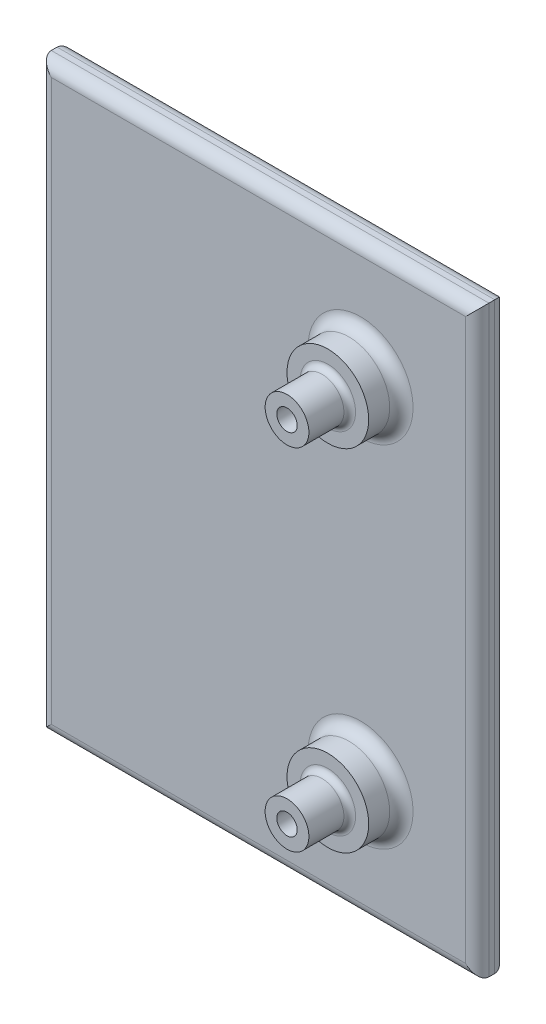
ISO-10303-21;
HEADER;
FILE_DESCRIPTION(('STEP AP214'),'2;1');
FILE_NAME('part.step','',(''),(''),'','','');
FILE_SCHEMA(('AUTOMOTIVE_DESIGN { 1 0 10303 214 1 1 1 1 }'));
ENDSEC;
DATA;
#1=APPLICATION_CONTEXT('core data for automotive mechanical design processes');
#2=APPLICATION_PROTOCOL_DEFINITION('international standard','automotive_design',2000,#1);
#3=PRODUCT_CONTEXT('',#1,'mechanical');
#4=PRODUCT('Part','Part','',(#3));
#5=PRODUCT_RELATED_PRODUCT_CATEGORY('part','',(#4));
#6=PRODUCT_DEFINITION_FORMATION('','',#4);
#7=PRODUCT_DEFINITION_CONTEXT('part definition',#1,'design');
#8=PRODUCT_DEFINITION('design','',#6,#7);
#9=PRODUCT_DEFINITION_SHAPE('','',#8);
#10=(LENGTH_UNIT() NAMED_UNIT(*) SI_UNIT(.MILLI.,.METRE.));
#11=(NAMED_UNIT(*) PLANE_ANGLE_UNIT() SI_UNIT($,.RADIAN.));
#12=(NAMED_UNIT(*) SI_UNIT($,.STERADIAN.) SOLID_ANGLE_UNIT());
#13=UNCERTAINTY_MEASURE_WITH_UNIT(LENGTH_MEASURE(1.E-05),#10,'distance_accuracy_value','');
#14=(GEOMETRIC_REPRESENTATION_CONTEXT(3) GLOBAL_UNCERTAINTY_ASSIGNED_CONTEXT((#13)) GLOBAL_UNIT_ASSIGNED_CONTEXT((#10,
#11,#12)) REPRESENTATION_CONTEXT('',''));
#15=CARTESIAN_POINT('',(0.,0.,0.));
#16=DIRECTION('',(0.,0.,1.));
#17=DIRECTION('',(1.,0.,0.));
#18=AXIS2_PLACEMENT_3D('',#15,#16,#17);
#19=CARTESIAN_POINT('',(0.,0.,5.));
#20=DIRECTION('',(0.,1.,0.));
#21=DIRECTION('',(-1.,0.,0.));
#22=AXIS2_PLACEMENT_3D('',#19,#20,#21);
#23=PLANE('',#22);
#24=DIRECTION('',(0.,0.,-1.));
#25=VECTOR('',#24,1.);
#26=CARTESIAN_POINT('',(-75.,0.,5.));
#27=LINE('',#26,#25);
#28=CARTESIAN_POINT('',(-75.,0.,3.));
#29=VERTEX_POINT('',#28);
#30=CARTESIAN_POINT('',(-75.,0.,2.));
#31=VERTEX_POINT('',#30);
#32=EDGE_CURVE('E293',#29,#31,#27,.T.);
#33=ORIENTED_EDGE('',*,*,#32,.T.);
#34=DIRECTION('',(1.,0.,0.));
#35=VECTOR('',#34,1.);
#36=CARTESIAN_POINT('',(0.,0.,2.));
#37=LINE('',#36,#35);
#38=CARTESIAN_POINT('',(0.,0.,2.));
#39=VERTEX_POINT('',#38);
#40=EDGE_CURVE('E186',#31,#39,#37,.T.);
#41=ORIENTED_EDGE('',*,*,#40,.T.);
#42=DIRECTION('',(0.,0.,-1.));
#43=VECTOR('',#42,1.);
#44=CARTESIAN_POINT('',(0.,0.,5.));
#45=LINE('',#44,#43);
#46=CARTESIAN_POINT('',(0.,0.,3.));
#47=VERTEX_POINT('',#46);
#48=EDGE_CURVE('E303',#47,#39,#45,.T.);
#49=ORIENTED_EDGE('',*,*,#48,.F.);
#50=DIRECTION('',(1.,0.,0.));
#51=VECTOR('',#50,1.);
#52=CARTESIAN_POINT('',(0.,0.,3.));
#53=LINE('',#52,#51);
#54=EDGE_CURVE('E68',#47,#29,#53,.F.);
#55=ORIENTED_EDGE('',*,*,#54,.T.);
#56=EDGE_LOOP('',(#33,#41,#49,#55));
#57=FACE_BOUND('',#56,.T.);
#58=ADVANCED_FACE('F45',(#57),#23,.F.);
#59=CARTESIAN_POINT('',(0.,0.,5.));
#60=DIRECTION('',(-1.,0.,0.));
#61=DIRECTION('',(0.,0.,1.));
#62=AXIS2_PLACEMENT_3D('',#59,#60,#61);
#63=PLANE('',#62);
#64=ORIENTED_EDGE('',*,*,#48,.T.);
#65=DIRECTION('',(0.,1.,0.));
#66=VECTOR('',#65,1.);
#67=CARTESIAN_POINT('',(0.,100.,2.));
#68=LINE('',#67,#66);
#69=CARTESIAN_POINT('',(0.,100.,2.));
#70=VERTEX_POINT('',#69);
#71=EDGE_CURVE('E181',#39,#70,#68,.T.);
#72=ORIENTED_EDGE('',*,*,#71,.T.);
#73=DIRECTION('',(0.,0.,-1.));
#74=VECTOR('',#73,1.);
#75=CARTESIAN_POINT('',(0.,100.,5.));
#76=LINE('',#75,#74);
#77=CARTESIAN_POINT('',(0.,100.,3.));
#78=VERTEX_POINT('',#77);
#79=EDGE_CURVE('E299',#78,#70,#76,.T.);
#80=ORIENTED_EDGE('',*,*,#79,.F.);
#81=DIRECTION('',(0.,1.,0.));
#82=VECTOR('',#81,1.);
#83=CARTESIAN_POINT('',(0.,0.,3.));
#84=LINE('',#83,#82);
#85=EDGE_CURVE('E178',#78,#47,#84,.F.);
#86=ORIENTED_EDGE('',*,*,#85,.T.);
#87=EDGE_LOOP('',(#64,#72,#80,#86));
#88=FACE_BOUND('',#87,.T.);
#89=ADVANCED_FACE('F240',(#88),#63,.F.);
#90=CARTESIAN_POINT('',(0.,100.,5.));
#91=DIRECTION('',(0.,-1.,0.));
#92=DIRECTION('',(1.,0.,0.));
#93=AXIS2_PLACEMENT_3D('',#90,#91,#92);
#94=PLANE('',#93);
#95=ORIENTED_EDGE('',*,*,#79,.T.);
#96=DIRECTION('',(-1.,0.,0.));
#97=VECTOR('',#96,1.);
#98=CARTESIAN_POINT('',(-75.,100.,2.));
#99=LINE('',#98,#97);
#100=CARTESIAN_POINT('',(-75.,100.,2.));
#101=VERTEX_POINT('',#100);
#102=EDGE_CURVE('E161',#70,#101,#99,.T.);
#103=ORIENTED_EDGE('',*,*,#102,.T.);
#104=DIRECTION('',(0.,0.,-1.));
#105=VECTOR('',#104,1.);
#106=CARTESIAN_POINT('',(-75.,100.,5.));
#107=LINE('',#106,#105);
#108=CARTESIAN_POINT('',(-75.,100.,3.));
#109=VERTEX_POINT('',#108);
#110=EDGE_CURVE('E292',#109,#101,#107,.T.);
#111=ORIENTED_EDGE('',*,*,#110,.F.);
#112=DIRECTION('',(-1.,0.,0.));
#113=VECTOR('',#112,1.);
#114=CARTESIAN_POINT('',(0.,100.,3.));
#115=LINE('',#114,#113);
#116=EDGE_CURVE('E120',#109,#78,#115,.F.);
#117=ORIENTED_EDGE('',*,*,#116,.T.);
#118=EDGE_LOOP('',(#95,#103,#111,#117));
#119=FACE_BOUND('',#118,.T.);
#120=ADVANCED_FACE('F246',(#119),#94,.F.);
#121=CARTESIAN_POINT('',(-75.,0.,5.));
#122=DIRECTION('',(1.,0.,0.));
#123=DIRECTION('',(0.,0.,-1.));
#124=AXIS2_PLACEMENT_3D('',#121,#122,#123);
#125=PLANE('',#124);
#126=ORIENTED_EDGE('',*,*,#110,.T.);
#127=DIRECTION('',(0.,-1.,0.));
#128=VECTOR('',#127,1.);
#129=CARTESIAN_POINT('',(-75.,0.,2.));
#130=LINE('',#129,#128);
#131=EDGE_CURVE('E61',#101,#31,#130,.T.);
#132=ORIENTED_EDGE('',*,*,#131,.T.);
#133=ORIENTED_EDGE('',*,*,#32,.F.);
#134=DIRECTION('',(0.,-1.,0.));
#135=VECTOR('',#134,1.);
#136=CARTESIAN_POINT('',(-75.,0.,3.));
#137=LINE('',#136,#135);
#138=EDGE_CURVE('E189',#29,#109,#137,.F.);
#139=ORIENTED_EDGE('',*,*,#138,.T.);
#140=EDGE_LOOP('',(#126,#132,#133,#139));
#141=FACE_BOUND('',#140,.T.);
#142=ADVANCED_FACE('F291',(#141),#125,.F.);
#143=CARTESIAN_POINT('',(0.,0.,5.));
#144=DIRECTION('',(0.,0.,-1.));
#145=DIRECTION('',(-1.,0.,0.));
#146=AXIS2_PLACEMENT_3D('',#143,#144,#145);
#147=PLANE('',#146);
#148=CARTESIAN_POINT('',(-20.,20.,5.));
#149=DIRECTION('',(0.,0.,-1.));
#150=DIRECTION('',(-1.,0.,0.));
#151=AXIS2_PLACEMENT_3D('',#148,#149,#150);
#152=CIRCLE('',#151,9.);
#153=CARTESIAN_POINT('',(-29.,20.,5.));
#154=VERTEX_POINT('',#153);
#155=EDGE_CURVE('E147',#154,#154,#152,.T.);
#156=ORIENTED_EDGE('',*,*,#155,.T.);
#157=EDGE_LOOP('',(#156));
#158=FACE_BOUND('',#157,.T.);
#159=CARTESIAN_POINT('',(-20.,80.,5.));
#160=DIRECTION('',(0.,0.,-1.));
#161=DIRECTION('',(-1.,0.,0.));
#162=AXIS2_PLACEMENT_3D('',#159,#160,#161);
#163=CIRCLE('',#162,9.);
#164=CARTESIAN_POINT('',(-29.,80.,5.));
#165=VERTEX_POINT('',#164);
#166=EDGE_CURVE('E142',#165,#165,#163,.T.);
#167=ORIENTED_EDGE('',*,*,#166,.T.);
#168=EDGE_LOOP('',(#167));
#169=FACE_BOUND('',#168,.T.);
#170=DIRECTION('',(0.,1.,0.));
#171=VECTOR('',#170,1.);
#172=CARTESIAN_POINT('',(-2.,0.,5.));
#173=LINE('',#172,#171);
#174=CARTESIAN_POINT('',(-2.,2.,5.));
#175=VERTEX_POINT('',#174);
#176=CARTESIAN_POINT('',(-2.,98.,5.));
#177=VERTEX_POINT('',#176);
#178=EDGE_CURVE('E139',#175,#177,#173,.T.);
#179=ORIENTED_EDGE('',*,*,#178,.T.);
#180=DIRECTION('',(-1.,0.,0.));
#181=VECTOR('',#180,1.);
#182=CARTESIAN_POINT('',(0.,98.,5.));
#183=LINE('',#182,#181);
#184=CARTESIAN_POINT('',(-73.,98.,5.));
#185=VERTEX_POINT('',#184);
#186=EDGE_CURVE('E118',#177,#185,#183,.T.);
#187=ORIENTED_EDGE('',*,*,#186,.T.);
#188=DIRECTION('',(0.,-1.,0.));
#189=VECTOR('',#188,1.);
#190=CARTESIAN_POINT('',(-73.,0.,5.));
#191=LINE('',#190,#189);
#192=CARTESIAN_POINT('',(-73.,1.99999999999999,5.));
#193=VERTEX_POINT('',#192);
#194=EDGE_CURVE('E127',#185,#193,#191,.T.);
#195=ORIENTED_EDGE('',*,*,#194,.T.);
#196=DIRECTION('',(1.,0.,0.));
#197=VECTOR('',#196,1.);
#198=CARTESIAN_POINT('',(0.,2.,5.));
#199=LINE('',#198,#197);
#200=EDGE_CURVE('E134',#193,#175,#199,.T.);
#201=ORIENTED_EDGE('',*,*,#200,.T.);
#202=EDGE_LOOP('',(#179,#187,#195,#201));
#203=FACE_BOUND('',#202,.T.);
#204=ADVANCED_FACE('F137',(#158,#169,#203),#147,.F.);
#205=CARTESIAN_POINT('',(0.,0.,0.));
#206=DIRECTION('',(0.,0.,-1.));
#207=DIRECTION('',(-1.,0.,0.));
#208=AXIS2_PLACEMENT_3D('',#205,#206,#207);
#209=PLANE('',#208);
#210=DIRECTION('',(0.,-1.,0.));
#211=VECTOR('',#210,1.);
#212=CARTESIAN_POINT('',(-73.,100.,0.));
#213=LINE('',#212,#211);
#214=CARTESIAN_POINT('',(-73.,1.99999999999999,0.));
#215=VERTEX_POINT('',#214);
#216=CARTESIAN_POINT('',(-73.,98.,0.));
#217=VERTEX_POINT('',#216);
#218=EDGE_CURVE('E165',#215,#217,#213,.F.);
#219=ORIENTED_EDGE('',*,*,#218,.T.);
#220=DIRECTION('',(-1.,0.,0.));
#221=VECTOR('',#220,1.);
#222=CARTESIAN_POINT('',(0.,98.,0.));
#223=LINE('',#222,#221);
#224=CARTESIAN_POINT('',(-2.,98.,0.));
#225=VERTEX_POINT('',#224);
#226=EDGE_CURVE('E174',#217,#225,#223,.F.);
#227=ORIENTED_EDGE('',*,*,#226,.T.);
#228=DIRECTION('',(0.,1.,0.));
#229=VECTOR('',#228,1.);
#230=CARTESIAN_POINT('',(-2.,0.,0.));
#231=LINE('',#230,#229);
#232=CARTESIAN_POINT('',(-2.,2.,0.));
#233=VERTEX_POINT('',#232);
#234=EDGE_CURVE('E171',#225,#233,#231,.F.);
#235=ORIENTED_EDGE('',*,*,#234,.T.);
#236=DIRECTION('',(1.,0.,0.));
#237=VECTOR('',#236,1.);
#238=CARTESIAN_POINT('',(-75.,1.99999999999999,0.));
#239=LINE('',#238,#237);
#240=EDGE_CURVE('E168',#233,#215,#239,.F.);
#241=ORIENTED_EDGE('',*,*,#240,.T.);
#242=EDGE_LOOP('',(#219,#227,#235,#241));
#243=FACE_BOUND('',#242,.T.);
#244=CARTESIAN_POINT('',(-20.,80.,0.));
#245=DIRECTION('',(0.,0.,-1.));
#246=DIRECTION('',(-1.,0.,0.));
#247=AXIS2_PLACEMENT_3D('',#244,#245,#246);
#248=CIRCLE('',#247,1.75);
#249=CARTESIAN_POINT('',(-21.75,80.,0.));
#250=VERTEX_POINT('',#249);
#251=EDGE_CURVE('E335',#250,#250,#248,.T.);
#252=ORIENTED_EDGE('',*,*,#251,.F.);
#253=EDGE_LOOP('',(#252));
#254=FACE_BOUND('',#253,.T.);
#255=CARTESIAN_POINT('',(-20.,20.,0.));
#256=DIRECTION('',(0.,0.,-1.));
#257=DIRECTION('',(-1.,0.,0.));
#258=AXIS2_PLACEMENT_3D('',#255,#256,#257);
#259=CIRCLE('',#258,1.75);
#260=CARTESIAN_POINT('',(-21.75,20.,0.));
#261=VERTEX_POINT('',#260);
#262=EDGE_CURVE('E338',#261,#261,#259,.F.);
#263=ORIENTED_EDGE('',*,*,#262,.T.);
#264=EDGE_LOOP('',(#263));
#265=FACE_BOUND('',#264,.T.);
#266=ADVANCED_FACE('F325',(#243,#254,#265),#209,.T.);
#267=CARTESIAN_POINT('',(-20.,20.,10.6));
#268=DIRECTION('',(0.,0.,-1.));
#269=DIRECTION('',(-1.,0.,0.));
#270=AXIS2_PLACEMENT_3D('',#267,#268,#269);
#271=CYLINDRICAL_SURFACE('',#270,7.);
#272=CARTESIAN_POINT('',(-20.,20.,7.));
#273=DIRECTION('',(0.,0.,-1.));
#274=DIRECTION('',(-1.,0.,0.));
#275=AXIS2_PLACEMENT_3D('',#272,#273,#274);
#276=CIRCLE('',#275,7.);
#277=CARTESIAN_POINT('',(-27.,20.,7.));
#278=VERTEX_POINT('',#277);
#279=EDGE_CURVE('E135',#278,#278,#276,.F.);
#280=ORIENTED_EDGE('',*,*,#279,.T.);
#281=EDGE_LOOP('',(#280));
#282=FACE_BOUND('',#281,.T.);
#283=CARTESIAN_POINT('',(-20.,20.,10.6));
#284=DIRECTION('',(0.,0.,1.));
#285=DIRECTION('',(1.,0.,0.));
#286=AXIS2_PLACEMENT_3D('',#283,#284,#285);
#287=CIRCLE('',#286,7.);
#288=CARTESIAN_POINT('',(-13.,20.,10.6));
#289=VERTEX_POINT('',#288);
#290=EDGE_CURVE('E305',#289,#289,#287,.T.);
#291=ORIENTED_EDGE('',*,*,#290,.F.);
#292=EDGE_LOOP('',(#291));
#293=FACE_BOUND('',#292,.T.);
#294=ADVANCED_FACE('F330',(#282,#293),#271,.T.);
#295=CARTESIAN_POINT('',(-20.,20.,10.6));
#296=DIRECTION('',(0.,0.,1.));
#297=DIRECTION('',(1.,0.,0.));
#298=AXIS2_PLACEMENT_3D('',#295,#296,#297);
#299=PLANE('',#298);
#300=CARTESIAN_POINT('',(-20.,20.,10.6));
#301=DIRECTION('',(0.,0.,1.));
#302=DIRECTION('',(1.,0.,0.));
#303=AXIS2_PLACEMENT_3D('',#300,#301,#302);
#304=CIRCLE('',#303,4.75);
#305=CARTESIAN_POINT('',(-15.25,20.,10.6));
#306=VERTEX_POINT('',#305);
#307=EDGE_CURVE('E11',#306,#306,#304,.F.);
#308=ORIENTED_EDGE('',*,*,#307,.T.);
#309=EDGE_LOOP('',(#308));
#310=FACE_BOUND('',#309,.T.);
#311=ORIENTED_EDGE('',*,*,#290,.T.);
#312=EDGE_LOOP('',(#311));
#313=FACE_BOUND('',#312,.T.);
#314=ADVANCED_FACE('F356',(#310,#313),#299,.T.);
#315=CARTESIAN_POINT('',(-20.,20.,17.6));
#316=DIRECTION('',(0.,0.,-1.));
#317=DIRECTION('',(-1.,0.,0.));
#318=AXIS2_PLACEMENT_3D('',#315,#316,#317);
#319=CYLINDRICAL_SURFACE('',#318,3.75);
#320=CARTESIAN_POINT('',(-20.,20.,11.6));
#321=DIRECTION('',(0.,0.,1.));
#322=DIRECTION('',(1.,0.,0.));
#323=AXIS2_PLACEMENT_3D('',#320,#321,#322);
#324=CIRCLE('',#323,3.75);
#325=CARTESIAN_POINT('',(-16.25,20.,11.6));
#326=VERTEX_POINT('',#325);
#327=EDGE_CURVE('E54',#326,#326,#324,.T.);
#328=ORIENTED_EDGE('',*,*,#327,.T.);
#329=EDGE_LOOP('',(#328));
#330=FACE_BOUND('',#329,.T.);
#331=CARTESIAN_POINT('',(-20.,20.,17.6));
#332=DIRECTION('',(0.,0.,1.));
#333=DIRECTION('',(1.,0.,0.));
#334=AXIS2_PLACEMENT_3D('',#331,#332,#333);
#335=CIRCLE('',#334,3.75);
#336=CARTESIAN_POINT('',(-16.25,20.,17.6));
#337=VERTEX_POINT('',#336);
#338=EDGE_CURVE('E341',#337,#337,#335,.T.);
#339=ORIENTED_EDGE('',*,*,#338,.F.);
#340=EDGE_LOOP('',(#339));
#341=FACE_BOUND('',#340,.T.);
#342=ADVANCED_FACE('F228',(#330,#341),#319,.T.);
#343=CARTESIAN_POINT('',(-20.,20.,17.6));
#344=DIRECTION('',(0.,0.,1.));
#345=DIRECTION('',(1.,0.,0.));
#346=AXIS2_PLACEMENT_3D('',#343,#344,#345);
#347=PLANE('',#346);
#348=CARTESIAN_POINT('',(-20.,20.,17.6));
#349=DIRECTION('',(0.,0.,1.));
#350=DIRECTION('',(1.,0.,0.));
#351=AXIS2_PLACEMENT_3D('',#348,#349,#350);
#352=CIRCLE('',#351,1.75);
#353=CARTESIAN_POINT('',(-18.25,20.,17.6));
#354=VERTEX_POINT('',#353);
#355=EDGE_CURVE('E342',#354,#354,#352,.T.);
#356=ORIENTED_EDGE('',*,*,#355,.F.);
#357=EDGE_LOOP('',(#356));
#358=FACE_BOUND('',#357,.T.);
#359=ORIENTED_EDGE('',*,*,#338,.T.);
#360=EDGE_LOOP('',(#359));
#361=FACE_BOUND('',#360,.T.);
#362=ADVANCED_FACE('F413',(#358,#361),#347,.T.);
#363=CARTESIAN_POINT('',(-20.,20.,-4.94974746830584));
#364=DIRECTION('',(0.,0.,1.));
#365=DIRECTION('',(1.,0.,0.));
#366=AXIS2_PLACEMENT_3D('',#363,#364,#365);
#367=CYLINDRICAL_SURFACE('',#366,1.75);
#368=ORIENTED_EDGE('',*,*,#355,.T.);
#369=EDGE_LOOP('',(#368));
#370=FACE_BOUND('',#369,.T.);
#371=ORIENTED_EDGE('',*,*,#262,.F.);
#372=EDGE_LOOP('',(#371));
#373=FACE_BOUND('',#372,.T.);
#374=ADVANCED_FACE('F422',(#370,#373),#367,.F.);
#375=CARTESIAN_POINT('',(-20.,80.,10.6));
#376=DIRECTION('',(0.,0.,-1.));
#377=DIRECTION('',(-1.,0.,0.));
#378=AXIS2_PLACEMENT_3D('',#375,#376,#377);
#379=CYLINDRICAL_SURFACE('',#378,7.);
#380=CARTESIAN_POINT('',(-20.,80.,7.));
#381=DIRECTION('',(0.,0.,-1.));
#382=DIRECTION('',(-1.,0.,0.));
#383=AXIS2_PLACEMENT_3D('',#380,#381,#382);
#384=CIRCLE('',#383,7.);
#385=CARTESIAN_POINT('',(-27.,80.,7.));
#386=VERTEX_POINT('',#385);
#387=EDGE_CURVE('E155',#386,#386,#384,.F.);
#388=ORIENTED_EDGE('',*,*,#387,.T.);
#389=EDGE_LOOP('',(#388));
#390=FACE_BOUND('',#389,.T.);
#391=CARTESIAN_POINT('',(-20.,80.,10.6));
#392=DIRECTION('',(0.,0.,-1.));
#393=DIRECTION('',(1.,0.,0.));
#394=AXIS2_PLACEMENT_3D('',#391,#392,#393);
#395=CIRCLE('',#394,7.);
#396=CARTESIAN_POINT('',(-13.,80.,10.6));
#397=VERTEX_POINT('',#396);
#398=EDGE_CURVE('E349',#397,#397,#395,.T.);
#399=ORIENTED_EDGE('',*,*,#398,.T.);
#400=EDGE_LOOP('',(#399));
#401=FACE_BOUND('',#400,.T.);
#402=ADVANCED_FACE('F432',(#390,#401),#379,.T.);
#403=CARTESIAN_POINT('',(-20.,80.,10.6));
#404=DIRECTION('',(0.,0.,1.));
#405=DIRECTION('',(1.,0.,0.));
#406=AXIS2_PLACEMENT_3D('',#403,#404,#405);
#407=PLANE('',#406);
#408=CARTESIAN_POINT('',(-20.,80.,10.6));
#409=DIRECTION('',(0.,0.,1.));
#410=DIRECTION('',(1.,0.,0.));
#411=AXIS2_PLACEMENT_3D('',#408,#409,#410);
#412=CIRCLE('',#411,4.75);
#413=CARTESIAN_POINT('',(-15.25,80.,10.6));
#414=VERTEX_POINT('',#413);
#415=EDGE_CURVE('E194',#414,#414,#412,.F.);
#416=ORIENTED_EDGE('',*,*,#415,.T.);
#417=EDGE_LOOP('',(#416));
#418=FACE_BOUND('',#417,.T.);
#419=ORIENTED_EDGE('',*,*,#398,.F.);
#420=EDGE_LOOP('',(#419));
#421=FACE_BOUND('',#420,.T.);
#422=ADVANCED_FACE('F442',(#418,#421),#407,.T.);
#423=CARTESIAN_POINT('',(-20.,80.,17.6));
#424=DIRECTION('',(0.,0.,-1.));
#425=DIRECTION('',(-1.,0.,0.));
#426=AXIS2_PLACEMENT_3D('',#423,#424,#425);
#427=CYLINDRICAL_SURFACE('',#426,3.75);
#428=CARTESIAN_POINT('',(-20.,80.,11.6));
#429=DIRECTION('',(0.,0.,1.));
#430=DIRECTION('',(1.,0.,0.));
#431=AXIS2_PLACEMENT_3D('',#428,#429,#430);
#432=CIRCLE('',#431,3.75);
#433=CARTESIAN_POINT('',(-16.25,80.,11.6));
#434=VERTEX_POINT('',#433);
#435=EDGE_CURVE('E221',#434,#434,#432,.T.);
#436=ORIENTED_EDGE('',*,*,#435,.T.);
#437=EDGE_LOOP('',(#436));
#438=FACE_BOUND('',#437,.T.);
#439=CARTESIAN_POINT('',(-20.,80.,17.6));
#440=DIRECTION('',(0.,0.,-1.));
#441=DIRECTION('',(1.,0.,0.));
#442=AXIS2_PLACEMENT_3D('',#439,#440,#441);
#443=CIRCLE('',#442,3.75);
#444=CARTESIAN_POINT('',(-16.25,80.,17.6));
#445=VERTEX_POINT('',#444);
#446=EDGE_CURVE('E553',#445,#445,#443,.T.);
#447=ORIENTED_EDGE('',*,*,#446,.T.);
#448=EDGE_LOOP('',(#447));
#449=FACE_BOUND('',#448,.T.);
#450=ADVANCED_FACE('F451',(#438,#449),#427,.T.);
#451=CARTESIAN_POINT('',(-20.,80.,17.6));
#452=DIRECTION('',(0.,0.,1.));
#453=DIRECTION('',(1.,0.,0.));
#454=AXIS2_PLACEMENT_3D('',#451,#452,#453);
#455=PLANE('',#454);
#456=CARTESIAN_POINT('',(-20.,80.,17.6));
#457=DIRECTION('',(0.,0.,-1.));
#458=DIRECTION('',(1.,0.,0.));
#459=AXIS2_PLACEMENT_3D('',#456,#457,#458);
#460=CIRCLE('',#459,1.75);
#461=CARTESIAN_POINT('',(-18.25,80.,17.6));
#462=VERTEX_POINT('',#461);
#463=EDGE_CURVE('E209',#462,#462,#460,.T.);
#464=ORIENTED_EDGE('',*,*,#463,.T.);
#465=EDGE_LOOP('',(#464));
#466=FACE_BOUND('',#465,.T.);
#467=ORIENTED_EDGE('',*,*,#446,.F.);
#468=EDGE_LOOP('',(#467));
#469=FACE_BOUND('',#468,.T.);
#470=ADVANCED_FACE('F461',(#466,#469),#455,.T.);
#471=CARTESIAN_POINT('',(-20.,80.,-4.94974746830584));
#472=DIRECTION('',(0.,0.,1.));
#473=DIRECTION('',(1.,0.,0.));
#474=AXIS2_PLACEMENT_3D('',#471,#472,#473);
#475=CYLINDRICAL_SURFACE('',#474,1.75);
#476=ORIENTED_EDGE('',*,*,#463,.F.);
#477=EDGE_LOOP('',(#476));
#478=FACE_BOUND('',#477,.T.);
#479=ORIENTED_EDGE('',*,*,#251,.T.);
#480=EDGE_LOOP('',(#479));
#481=FACE_BOUND('',#480,.T.);
#482=ADVANCED_FACE('F255',(#478,#481),#475,.F.);
#483=CARTESIAN_POINT('',(-20.,20.,7.));
#484=DIRECTION('',(0.,0.,-1.));
#485=DIRECTION('',(-1.,0.,0.));
#486=AXIS2_PLACEMENT_3D('',#483,#484,#485);
#487=TOROIDAL_SURFACE('',#486,9.,2.);
#488=ORIENTED_EDGE('',*,*,#155,.F.);
#489=EDGE_LOOP('',(#488));
#490=FACE_BOUND('',#489,.T.);
#491=ORIENTED_EDGE('',*,*,#279,.F.);
#492=EDGE_LOOP('',(#491));
#493=FACE_BOUND('',#492,.T.);
#494=ADVANCED_FACE('F251',(#490,#493),#487,.F.);
#495=CARTESIAN_POINT('',(-20.,80.,7.));
#496=DIRECTION('',(0.,0.,-1.));
#497=DIRECTION('',(-1.,0.,0.));
#498=AXIS2_PLACEMENT_3D('',#495,#496,#497);
#499=TOROIDAL_SURFACE('',#498,9.,2.);
#500=ORIENTED_EDGE('',*,*,#387,.F.);
#501=EDGE_LOOP('',(#500));
#502=FACE_BOUND('',#501,.T.);
#503=ORIENTED_EDGE('',*,*,#166,.F.);
#504=EDGE_LOOP('',(#503));
#505=FACE_BOUND('',#504,.T.);
#506=ADVANCED_FACE('F254',(#502,#505),#499,.F.);
#507=CARTESIAN_POINT('',(0.,2.,2.));
#508=DIRECTION('',(-1.,0.,0.));
#509=DIRECTION('',(0.,-1.,0.));
#510=AXIS2_PLACEMENT_3D('',#507,#508,#509);
#511=CYLINDRICAL_SURFACE('',#510,2.);
#512=CARTESIAN_POINT('',(-73.,1.99999999999999,2.));
#513=DIRECTION('',(-0.707106781186548,0.707106781186547,0.));
#514=DIRECTION('',(0.707106781186547,0.707106781186548,0.));
#515=AXIS2_PLACEMENT_3D('',#512,#513,#514);
#516=ELLIPSE('',#515,2.82842712474619,2.);
#517=EDGE_CURVE('E202',#215,#31,#516,.T.);
#518=ORIENTED_EDGE('',*,*,#517,.F.);
#519=ORIENTED_EDGE('',*,*,#240,.F.);
#520=CARTESIAN_POINT('',(-2.,2.,2.));
#521=DIRECTION('',(-0.707106781186547,-0.707106781186548,0.));
#522=DIRECTION('',(-0.707106781186548,0.707106781186547,0.));
#523=AXIS2_PLACEMENT_3D('',#520,#521,#522);
#524=ELLIPSE('',#523,2.82842712474619,2.);
#525=EDGE_CURVE('E206',#39,#233,#524,.F.);
#526=ORIENTED_EDGE('',*,*,#525,.F.);
#527=ORIENTED_EDGE('',*,*,#40,.F.);
#528=EDGE_LOOP('',(#518,#519,#526,#527));
#529=FACE_BOUND('',#528,.T.);
#530=ADVANCED_FACE('F259',(#529),#511,.T.);
#531=CARTESIAN_POINT('',(-2.,0.,2.));
#532=DIRECTION('',(0.,-1.,0.));
#533=DIRECTION('',(0.,0.,-1.));
#534=AXIS2_PLACEMENT_3D('',#531,#532,#533);
#535=CYLINDRICAL_SURFACE('',#534,2.);
#536=ORIENTED_EDGE('',*,*,#525,.T.);
#537=ORIENTED_EDGE('',*,*,#234,.F.);
#538=CARTESIAN_POINT('',(-2.,98.,2.));
#539=DIRECTION('',(0.707106781186548,-0.707106781186547,0.));
#540=DIRECTION('',(-0.707106781186547,-0.707106781186548,0.));
#541=AXIS2_PLACEMENT_3D('',#538,#539,#540);
#542=ELLIPSE('',#541,2.82842712474619,2.);
#543=EDGE_CURVE('E198',#70,#225,#542,.F.);
#544=ORIENTED_EDGE('',*,*,#543,.F.);
#545=ORIENTED_EDGE('',*,*,#71,.F.);
#546=EDGE_LOOP('',(#536,#537,#544,#545));
#547=FACE_BOUND('',#546,.T.);
#548=ADVANCED_FACE('F269',(#547),#535,.T.);
#549=CARTESIAN_POINT('',(-73.,0.,2.));
#550=DIRECTION('',(0.,1.,0.));
#551=DIRECTION('',(0.,0.,1.));
#552=AXIS2_PLACEMENT_3D('',#549,#550,#551);
#553=CYLINDRICAL_SURFACE('',#552,2.);
#554=ORIENTED_EDGE('',*,*,#517,.T.);
#555=ORIENTED_EDGE('',*,*,#131,.F.);
#556=CARTESIAN_POINT('',(-73.,98.,2.));
#557=DIRECTION('',(0.707106781186547,0.707106781186548,0.));
#558=DIRECTION('',(-0.707106781186548,0.707106781186547,0.));
#559=AXIS2_PLACEMENT_3D('',#556,#557,#558);
#560=ELLIPSE('',#559,2.82842712474619,2.);
#561=EDGE_CURVE('E195',#217,#101,#560,.T.);
#562=ORIENTED_EDGE('',*,*,#561,.F.);
#563=ORIENTED_EDGE('',*,*,#218,.F.);
#564=EDGE_LOOP('',(#554,#555,#562,#563));
#565=FACE_BOUND('',#564,.T.);
#566=ADVANCED_FACE('F265',(#565),#553,.T.);
#567=CARTESIAN_POINT('',(0.,98.,2.));
#568=DIRECTION('',(1.,0.,0.));
#569=DIRECTION('',(0.,1.,0.));
#570=AXIS2_PLACEMENT_3D('',#567,#568,#569);
#571=CYLINDRICAL_SURFACE('',#570,2.);
#572=ORIENTED_EDGE('',*,*,#543,.T.);
#573=ORIENTED_EDGE('',*,*,#226,.F.);
#574=ORIENTED_EDGE('',*,*,#561,.T.);
#575=ORIENTED_EDGE('',*,*,#102,.F.);
#576=EDGE_LOOP('',(#572,#573,#574,#575));
#577=FACE_BOUND('',#576,.T.);
#578=ADVANCED_FACE('F261',(#577),#571,.T.);
#579=CARTESIAN_POINT('',(0.,2.,3.));
#580=DIRECTION('',(1.,0.,0.));
#581=DIRECTION('',(0.,1.,0.));
#582=AXIS2_PLACEMENT_3D('',#579,#580,#581);
#583=CYLINDRICAL_SURFACE('',#582,2.);
#584=CARTESIAN_POINT('',(-73.,1.99999999999999,3.));
#585=DIRECTION('',(0.707106781186548,-0.707106781186547,0.));
#586=DIRECTION('',(-0.707106781186547,-0.707106781186548,0.));
#587=AXIS2_PLACEMENT_3D('',#584,#585,#586);
#588=ELLIPSE('',#587,2.82842712474619,2.);
#589=EDGE_CURVE('E130',#29,#193,#588,.F.);
#590=ORIENTED_EDGE('',*,*,#589,.F.);
#591=ORIENTED_EDGE('',*,*,#54,.F.);
#592=CARTESIAN_POINT('',(-2.,2.,3.));
#593=DIRECTION('',(0.707106781186547,0.707106781186548,0.));
#594=DIRECTION('',(0.707106781186548,-0.707106781186547,0.));
#595=AXIS2_PLACEMENT_3D('',#592,#593,#594);
#596=ELLIPSE('',#595,2.82842712474619,2.);
#597=EDGE_CURVE('E199',#175,#47,#596,.T.);
#598=ORIENTED_EDGE('',*,*,#597,.F.);
#599=ORIENTED_EDGE('',*,*,#200,.F.);
#600=EDGE_LOOP('',(#590,#591,#598,#599));
#601=FACE_BOUND('',#600,.T.);
#602=ADVANCED_FACE('F264',(#601),#583,.T.);
#603=CARTESIAN_POINT('',(-2.,0.,3.));
#604=DIRECTION('',(0.,1.,0.));
#605=DIRECTION('',(0.,0.,1.));
#606=AXIS2_PLACEMENT_3D('',#603,#604,#605);
#607=CYLINDRICAL_SURFACE('',#606,2.);
#608=ORIENTED_EDGE('',*,*,#597,.T.);
#609=ORIENTED_EDGE('',*,*,#85,.F.);
#610=CARTESIAN_POINT('',(-2.,98.,3.));
#611=DIRECTION('',(-0.707106781186548,0.707106781186547,0.));
#612=DIRECTION('',(0.707106781186547,0.707106781186548,0.));
#613=AXIS2_PLACEMENT_3D('',#610,#611,#612);
#614=ELLIPSE('',#613,2.82842712474619,2.);
#615=EDGE_CURVE('E124',#177,#78,#614,.T.);
#616=ORIENTED_EDGE('',*,*,#615,.F.);
#617=ORIENTED_EDGE('',*,*,#178,.F.);
#618=EDGE_LOOP('',(#608,#609,#616,#617));
#619=FACE_BOUND('',#618,.T.);
#620=ADVANCED_FACE('F281',(#619),#607,.T.);
#621=CARTESIAN_POINT('',(-73.,0.,3.));
#622=DIRECTION('',(0.,-1.,0.));
#623=DIRECTION('',(0.,0.,-1.));
#624=AXIS2_PLACEMENT_3D('',#621,#622,#623);
#625=CYLINDRICAL_SURFACE('',#624,2.);
#626=ORIENTED_EDGE('',*,*,#589,.T.);
#627=ORIENTED_EDGE('',*,*,#194,.F.);
#628=CARTESIAN_POINT('',(-73.,98.,3.));
#629=DIRECTION('',(-0.707106781186547,-0.707106781186548,0.));
#630=DIRECTION('',(0.707106781186548,-0.707106781186547,0.));
#631=AXIS2_PLACEMENT_3D('',#628,#629,#630);
#632=ELLIPSE('',#631,2.82842712474619,2.);
#633=EDGE_CURVE('E114',#109,#185,#632,.F.);
#634=ORIENTED_EDGE('',*,*,#633,.F.);
#635=ORIENTED_EDGE('',*,*,#138,.F.);
#636=EDGE_LOOP('',(#626,#627,#634,#635));
#637=FACE_BOUND('',#636,.T.);
#638=ADVANCED_FACE('F128',(#637),#625,.T.);
#639=CARTESIAN_POINT('',(0.,98.,3.));
#640=DIRECTION('',(-1.,0.,0.));
#641=DIRECTION('',(0.,-1.,0.));
#642=AXIS2_PLACEMENT_3D('',#639,#640,#641);
#643=CYLINDRICAL_SURFACE('',#642,2.);
#644=ORIENTED_EDGE('',*,*,#615,.T.);
#645=ORIENTED_EDGE('',*,*,#116,.F.);
#646=ORIENTED_EDGE('',*,*,#633,.T.);
#647=ORIENTED_EDGE('',*,*,#186,.F.);
#648=EDGE_LOOP('',(#644,#645,#646,#647));
#649=FACE_BOUND('',#648,.T.);
#650=ADVANCED_FACE('F116',(#649),#643,.T.);
#651=CARTESIAN_POINT('',(-20.,80.,11.6));
#652=DIRECTION('',(0.,0.,1.));
#653=DIRECTION('',(1.,0.,0.));
#654=AXIS2_PLACEMENT_3D('',#651,#652,#653);
#655=TOROIDAL_SURFACE('',#654,4.75,1.);
#656=ORIENTED_EDGE('',*,*,#435,.F.);
#657=EDGE_LOOP('',(#656));
#658=FACE_BOUND('',#657,.T.);
#659=ORIENTED_EDGE('',*,*,#415,.F.);
#660=EDGE_LOOP('',(#659));
#661=FACE_BOUND('',#660,.T.);
#662=ADVANCED_FACE('F232',(#658,#661),#655,.F.);
#663=CARTESIAN_POINT('',(-20.,20.,11.6));
#664=DIRECTION('',(0.,0.,1.));
#665=DIRECTION('',(1.,0.,0.));
#666=AXIS2_PLACEMENT_3D('',#663,#664,#665);
#667=TOROIDAL_SURFACE('',#666,4.75,1.);
#668=ORIENTED_EDGE('',*,*,#307,.F.);
#669=EDGE_LOOP('',(#668));
#670=FACE_BOUND('',#669,.T.);
#671=ORIENTED_EDGE('',*,*,#327,.F.);
#672=EDGE_LOOP('',(#671));
#673=FACE_BOUND('',#672,.T.);
#674=ADVANCED_FACE('F47',(#670,#673),#667,.F.);
#675=CLOSED_SHELL('',(#58,#89,#120,#142,#204,#266,#294,#314,#342,#362,#374,#402,#422,#450,#470,
#482,#494,#506,#530,#548,#566,#578,#602,#620,#638,#650,#662,#674));
#676=MANIFOLD_SOLID_BREP('B2',#675);
#677=ADVANCED_BREP_SHAPE_REPRESENTATION('',(#18,#676),#14);
#678=SHAPE_DEFINITION_REPRESENTATION(#9,#677);
ENDSEC;
END-ISO-10303-21;
